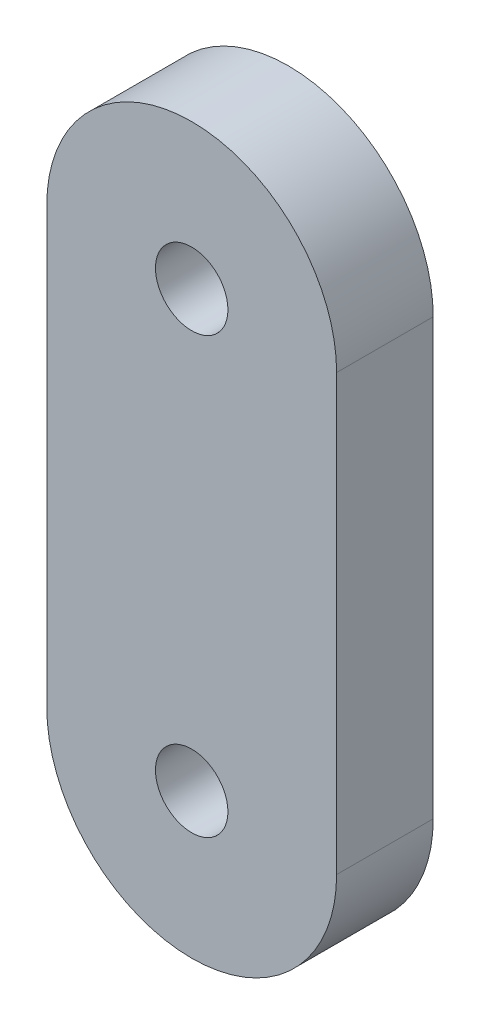
ISO-10303-21;
HEADER;
FILE_DESCRIPTION(('STEP AP214'),'2;1');
FILE_NAME('part.step','',(''),(''),'','','');
FILE_SCHEMA(('AUTOMOTIVE_DESIGN { 1 0 10303 214 1 1 1 1 }'));
ENDSEC;
DATA;
#1=APPLICATION_CONTEXT('core data for automotive mechanical design processes');
#2=APPLICATION_PROTOCOL_DEFINITION('international standard','automotive_design',2000,#1);
#3=PRODUCT_CONTEXT('',#1,'mechanical');
#4=PRODUCT('Part','Part','',(#3));
#5=PRODUCT_RELATED_PRODUCT_CATEGORY('part','',(#4));
#6=PRODUCT_DEFINITION_FORMATION('','',#4);
#7=PRODUCT_DEFINITION_CONTEXT('part definition',#1,'design');
#8=PRODUCT_DEFINITION('design','',#6,#7);
#9=PRODUCT_DEFINITION_SHAPE('','',#8);
#10=(LENGTH_UNIT() NAMED_UNIT(*) SI_UNIT(.MILLI.,.METRE.));
#11=(NAMED_UNIT(*) PLANE_ANGLE_UNIT() SI_UNIT($,.RADIAN.));
#12=(NAMED_UNIT(*) SI_UNIT($,.STERADIAN.) SOLID_ANGLE_UNIT());
#13=UNCERTAINTY_MEASURE_WITH_UNIT(LENGTH_MEASURE(1.E-05),#10,'distance_accuracy_value','');
#14=(GEOMETRIC_REPRESENTATION_CONTEXT(3) GLOBAL_UNCERTAINTY_ASSIGNED_CONTEXT((#13)) GLOBAL_UNIT_ASSIGNED_CONTEXT((#10,
#11,#12)) REPRESENTATION_CONTEXT('',''));
#15=CARTESIAN_POINT('',(0.,0.,0.));
#16=DIRECTION('',(0.,0.,1.));
#17=DIRECTION('',(1.,0.,0.));
#18=AXIS2_PLACEMENT_3D('',#15,#16,#17);
#19=CARTESIAN_POINT('',(0.,-36.,0.));
#20=DIRECTION('',(0.,0.,1.));
#21=DIRECTION('',(1.,0.,0.));
#22=AXIS2_PLACEMENT_3D('',#19,#20,#21);
#23=CYLINDRICAL_SURFACE('',#22,12.);
#24=CARTESIAN_POINT('',(0.,-36.,8.));
#25=DIRECTION('',(0.,0.,1.));
#26=DIRECTION('',(1.,0.,0.));
#27=AXIS2_PLACEMENT_3D('',#24,#25,#26);
#28=CIRCLE('',#27,12.);
#29=CARTESIAN_POINT('',(-12.,-36.,8.));
#30=VERTEX_POINT('',#29);
#31=CARTESIAN_POINT('',(12.,-36.,8.));
#32=VERTEX_POINT('',#31);
#33=EDGE_CURVE('E101',#30,#32,#28,.T.);
#34=ORIENTED_EDGE('',*,*,#33,.F.);
#35=DIRECTION('',(0.,0.,1.));
#36=VECTOR('',#35,1.);
#37=CARTESIAN_POINT('',(-12.,-36.,0.));
#38=LINE('',#37,#36);
#39=CARTESIAN_POINT('',(-12.,-36.,0.));
#40=VERTEX_POINT('',#39);
#41=EDGE_CURVE('E11',#40,#30,#38,.T.);
#42=ORIENTED_EDGE('',*,*,#41,.F.);
#43=CARTESIAN_POINT('',(0.,-36.,0.));
#44=DIRECTION('',(0.,0.,1.));
#45=DIRECTION('',(1.,0.,0.));
#46=AXIS2_PLACEMENT_3D('',#43,#44,#45);
#47=CIRCLE('',#46,12.);
#48=CARTESIAN_POINT('',(12.,-36.,0.));
#49=VERTEX_POINT('',#48);
#50=EDGE_CURVE('E94',#40,#49,#47,.T.);
#51=ORIENTED_EDGE('',*,*,#50,.T.);
#52=DIRECTION('',(0.,0.,1.));
#53=VECTOR('',#52,1.);
#54=CARTESIAN_POINT('',(12.,-36.,0.));
#55=LINE('',#54,#53);
#56=EDGE_CURVE('E39',#49,#32,#55,.T.);
#57=ORIENTED_EDGE('',*,*,#56,.T.);
#58=EDGE_LOOP('',(#34,#42,#51,#57));
#59=FACE_BOUND('',#58,.T.);
#60=ADVANCED_FACE('F36',(#59),#23,.T.);
#61=CARTESIAN_POINT('',(-12.,0.,0.));
#62=DIRECTION('',(-1.,0.,0.));
#63=DIRECTION('',(0.,0.,1.));
#64=AXIS2_PLACEMENT_3D('',#61,#62,#63);
#65=PLANE('',#64);
#66=DIRECTION('',(0.,-1.,0.));
#67=VECTOR('',#66,1.);
#68=CARTESIAN_POINT('',(-12.,0.,8.));
#69=LINE('',#68,#67);
#70=CARTESIAN_POINT('',(-12.,0.,8.));
#71=VERTEX_POINT('',#70);
#72=EDGE_CURVE('E96',#71,#30,#69,.T.);
#73=ORIENTED_EDGE('',*,*,#72,.F.);
#74=DIRECTION('',(0.,0.,1.));
#75=VECTOR('',#74,1.);
#76=CARTESIAN_POINT('',(-12.,0.,0.));
#77=LINE('',#76,#75);
#78=CARTESIAN_POINT('',(-12.,0.,0.));
#79=VERTEX_POINT('',#78);
#80=EDGE_CURVE('E45',#79,#71,#77,.T.);
#81=ORIENTED_EDGE('',*,*,#80,.F.);
#82=DIRECTION('',(0.,-1.,0.));
#83=VECTOR('',#82,1.);
#84=CARTESIAN_POINT('',(-12.,0.,0.));
#85=LINE('',#84,#83);
#86=EDGE_CURVE('E91',#79,#40,#85,.T.);
#87=ORIENTED_EDGE('',*,*,#86,.T.);
#88=ORIENTED_EDGE('',*,*,#41,.T.);
#89=EDGE_LOOP('',(#73,#81,#87,#88));
#90=FACE_BOUND('',#89,.T.);
#91=ADVANCED_FACE('F112',(#90),#65,.T.);
#92=CARTESIAN_POINT('',(0.,0.,0.));
#93=DIRECTION('',(0.,0.,1.));
#94=DIRECTION('',(1.,0.,0.));
#95=AXIS2_PLACEMENT_3D('',#92,#93,#94);
#96=CYLINDRICAL_SURFACE('',#95,12.);
#97=CARTESIAN_POINT('',(0.,0.,8.));
#98=DIRECTION('',(0.,0.,1.));
#99=DIRECTION('',(1.,0.,0.));
#100=AXIS2_PLACEMENT_3D('',#97,#98,#99);
#101=CIRCLE('',#100,12.);
#102=CARTESIAN_POINT('',(12.,0.,8.));
#103=VERTEX_POINT('',#102);
#104=EDGE_CURVE('E86',#103,#71,#101,.T.);
#105=ORIENTED_EDGE('',*,*,#104,.F.);
#106=DIRECTION('',(0.,0.,1.));
#107=VECTOR('',#106,1.);
#108=CARTESIAN_POINT('',(12.,0.,0.));
#109=LINE('',#108,#107);
#110=CARTESIAN_POINT('',(12.,0.,0.));
#111=VERTEX_POINT('',#110);
#112=EDGE_CURVE('E81',#111,#103,#109,.T.);
#113=ORIENTED_EDGE('',*,*,#112,.F.);
#114=CARTESIAN_POINT('',(0.,0.,0.));
#115=DIRECTION('',(0.,0.,1.));
#116=DIRECTION('',(1.,0.,0.));
#117=AXIS2_PLACEMENT_3D('',#114,#115,#116);
#118=CIRCLE('',#117,12.);
#119=EDGE_CURVE('E84',#111,#79,#118,.T.);
#120=ORIENTED_EDGE('',*,*,#119,.T.);
#121=ORIENTED_EDGE('',*,*,#80,.T.);
#122=EDGE_LOOP('',(#105,#113,#120,#121));
#123=FACE_BOUND('',#122,.T.);
#124=ADVANCED_FACE('F83',(#123),#96,.T.);
#125=CARTESIAN_POINT('',(12.,-36.,0.));
#126=DIRECTION('',(1.,0.,0.));
#127=DIRECTION('',(0.,1.,0.));
#128=AXIS2_PLACEMENT_3D('',#125,#126,#127);
#129=PLANE('',#128);
#130=DIRECTION('',(0.,1.,0.));
#131=VECTOR('',#130,1.);
#132=CARTESIAN_POINT('',(12.,-36.,8.));
#133=LINE('',#132,#131);
#134=EDGE_CURVE('E104',#32,#103,#133,.T.);
#135=ORIENTED_EDGE('',*,*,#134,.F.);
#136=ORIENTED_EDGE('',*,*,#56,.F.);
#137=DIRECTION('',(0.,1.,0.));
#138=VECTOR('',#137,1.);
#139=CARTESIAN_POINT('',(12.,-36.,0.));
#140=LINE('',#139,#138);
#141=EDGE_CURVE('E90',#49,#111,#140,.T.);
#142=ORIENTED_EDGE('',*,*,#141,.T.);
#143=ORIENTED_EDGE('',*,*,#112,.T.);
#144=EDGE_LOOP('',(#135,#136,#142,#143));
#145=FACE_BOUND('',#144,.T.);
#146=ADVANCED_FACE('F93',(#145),#129,.T.);
#147=CARTESIAN_POINT('',(0.,-36.,0.));
#148=DIRECTION('',(0.,0.,1.));
#149=DIRECTION('',(1.,0.,0.));
#150=AXIS2_PLACEMENT_3D('',#147,#148,#149);
#151=PLANE('',#150);
#152=CARTESIAN_POINT('',(0.,0.,0.));
#153=DIRECTION('',(0.,0.,1.));
#154=DIRECTION('',(1.,0.,0.));
#155=AXIS2_PLACEMENT_3D('',#152,#153,#154);
#156=CIRCLE('',#155,3.);
#157=CARTESIAN_POINT('',(3.00000000000001,0.,0.));
#158=VERTEX_POINT('',#157);
#159=EDGE_CURVE('E145',#158,#158,#156,.T.);
#160=ORIENTED_EDGE('',*,*,#159,.T.);
#161=EDGE_LOOP('',(#160));
#162=FACE_BOUND('',#161,.T.);
#163=CARTESIAN_POINT('',(0.,-36.,0.));
#164=DIRECTION('',(0.,0.,1.));
#165=DIRECTION('',(1.,0.,0.));
#166=AXIS2_PLACEMENT_3D('',#163,#164,#165);
#167=CIRCLE('',#166,3.);
#168=CARTESIAN_POINT('',(3.,-36.,0.));
#169=VERTEX_POINT('',#168);
#170=EDGE_CURVE('E105',#169,#169,#167,.T.);
#171=ORIENTED_EDGE('',*,*,#170,.T.);
#172=EDGE_LOOP('',(#171));
#173=FACE_BOUND('',#172,.T.);
#174=ORIENTED_EDGE('',*,*,#50,.F.);
#175=ORIENTED_EDGE('',*,*,#86,.F.);
#176=ORIENTED_EDGE('',*,*,#119,.F.);
#177=ORIENTED_EDGE('',*,*,#141,.F.);
#178=EDGE_LOOP('',(#174,#175,#176,#177));
#179=FACE_BOUND('',#178,.T.);
#180=ADVANCED_FACE('F89',(#162,#173,#179),#151,.F.);
#181=CARTESIAN_POINT('',(0.,-36.,8.));
#182=DIRECTION('',(0.,0.,1.));
#183=DIRECTION('',(1.,0.,0.));
#184=AXIS2_PLACEMENT_3D('',#181,#182,#183);
#185=PLANE('',#184);
#186=CARTESIAN_POINT('',(0.,0.,8.));
#187=DIRECTION('',(0.,0.,1.));
#188=DIRECTION('',(1.,0.,0.));
#189=AXIS2_PLACEMENT_3D('',#186,#187,#188);
#190=CIRCLE('',#189,3.);
#191=CARTESIAN_POINT('',(3.00000000000001,0.,8.));
#192=VERTEX_POINT('',#191);
#193=EDGE_CURVE('E148',#192,#192,#190,.T.);
#194=ORIENTED_EDGE('',*,*,#193,.F.);
#195=EDGE_LOOP('',(#194));
#196=FACE_BOUND('',#195,.T.);
#197=CARTESIAN_POINT('',(0.,-36.,8.));
#198=DIRECTION('',(0.,0.,1.));
#199=DIRECTION('',(1.,0.,0.));
#200=AXIS2_PLACEMENT_3D('',#197,#198,#199);
#201=CIRCLE('',#200,3.);
#202=CARTESIAN_POINT('',(3.,-36.,8.));
#203=VERTEX_POINT('',#202);
#204=EDGE_CURVE('E150',#203,#203,#201,.T.);
#205=ORIENTED_EDGE('',*,*,#204,.F.);
#206=EDGE_LOOP('',(#205));
#207=FACE_BOUND('',#206,.T.);
#208=ORIENTED_EDGE('',*,*,#33,.T.);
#209=ORIENTED_EDGE('',*,*,#134,.T.);
#210=ORIENTED_EDGE('',*,*,#104,.T.);
#211=ORIENTED_EDGE('',*,*,#72,.T.);
#212=EDGE_LOOP('',(#208,#209,#210,#211));
#213=FACE_BOUND('',#212,.T.);
#214=ADVANCED_FACE('F111',(#196,#207,#213),#185,.T.);
#215=CARTESIAN_POINT('',(0.,-36.,0.));
#216=DIRECTION('',(0.,0.,1.));
#217=DIRECTION('',(1.,0.,0.));
#218=AXIS2_PLACEMENT_3D('',#215,#216,#217);
#219=CYLINDRICAL_SURFACE('',#218,3.);
#220=ORIENTED_EDGE('',*,*,#170,.F.);
#221=EDGE_LOOP('',(#220));
#222=FACE_BOUND('',#221,.T.);
#223=ORIENTED_EDGE('',*,*,#204,.T.);
#224=EDGE_LOOP('',(#223));
#225=FACE_BOUND('',#224,.T.);
#226=ADVANCED_FACE('F130',(#222,#225),#219,.F.);
#227=CARTESIAN_POINT('',(0.,0.,0.));
#228=DIRECTION('',(0.,0.,1.));
#229=DIRECTION('',(1.,0.,0.));
#230=AXIS2_PLACEMENT_3D('',#227,#228,#229);
#231=CYLINDRICAL_SURFACE('',#230,3.);
#232=ORIENTED_EDGE('',*,*,#159,.F.);
#233=EDGE_LOOP('',(#232));
#234=FACE_BOUND('',#233,.T.);
#235=ORIENTED_EDGE('',*,*,#193,.T.);
#236=EDGE_LOOP('',(#235));
#237=FACE_BOUND('',#236,.T.);
#238=ADVANCED_FACE('F137',(#234,#237),#231,.F.);
#239=CLOSED_SHELL('',(#60,#91,#124,#146,#180,#214,#226,#238));
#240=MANIFOLD_SOLID_BREP('B2',#239);
#241=ADVANCED_BREP_SHAPE_REPRESENTATION('',(#18,#240),#14);
#242=SHAPE_DEFINITION_REPRESENTATION(#9,#241);
ENDSEC;
END-ISO-10303-21;
